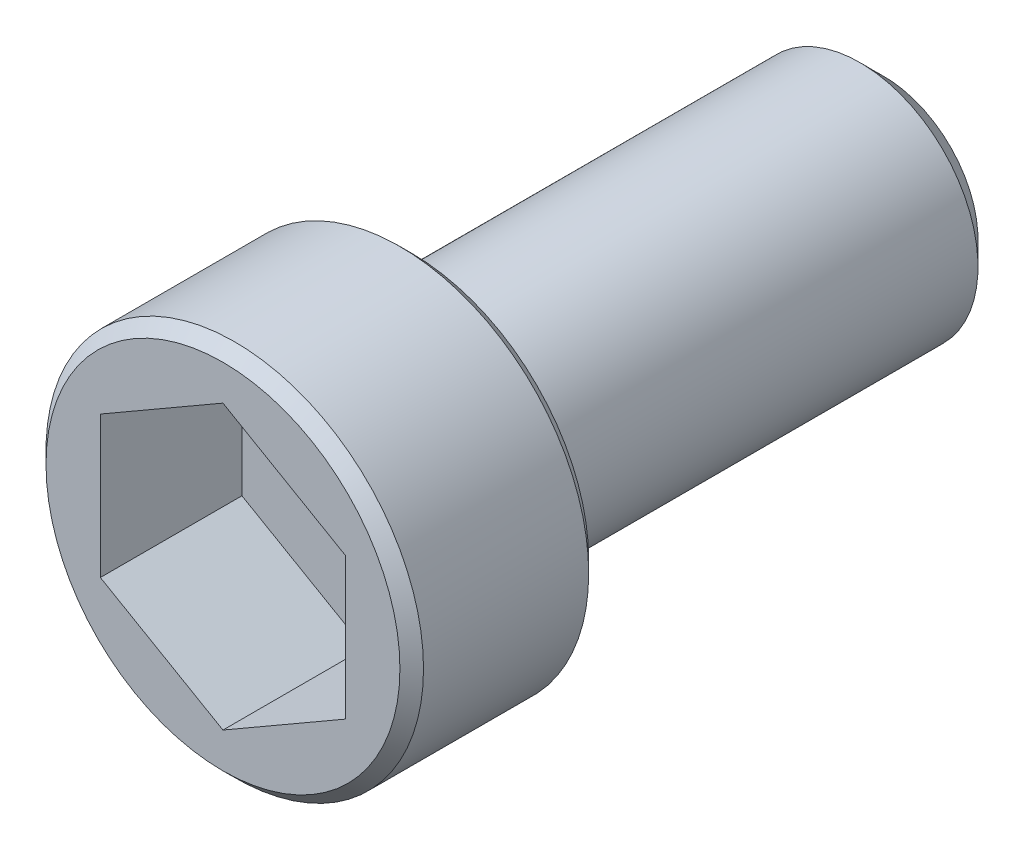
ISO-10303-21;
HEADER;
FILE_DESCRIPTION(('STEP AP214'),'2;1');
FILE_NAME('part.step','',(''),(''),'','','');
FILE_SCHEMA(('AUTOMOTIVE_DESIGN { 1 0 10303 214 1 1 1 1 }'));
ENDSEC;
DATA;
#1=APPLICATION_CONTEXT('core data for automotive mechanical design processes');
#2=APPLICATION_PROTOCOL_DEFINITION('international standard','automotive_design',2000,#1);
#3=PRODUCT_CONTEXT('',#1,'mechanical');
#4=PRODUCT('Part','Part','',(#3));
#5=PRODUCT_RELATED_PRODUCT_CATEGORY('part','',(#4));
#6=PRODUCT_DEFINITION_FORMATION('','',#4);
#7=PRODUCT_DEFINITION_CONTEXT('part definition',#1,'design');
#8=PRODUCT_DEFINITION('design','',#6,#7);
#9=PRODUCT_DEFINITION_SHAPE('','',#8);
#10=(LENGTH_UNIT() NAMED_UNIT(*) SI_UNIT(.MILLI.,.METRE.));
#11=(NAMED_UNIT(*) PLANE_ANGLE_UNIT() SI_UNIT($,.RADIAN.));
#12=(NAMED_UNIT(*) SI_UNIT($,.STERADIAN.) SOLID_ANGLE_UNIT());
#13=UNCERTAINTY_MEASURE_WITH_UNIT(LENGTH_MEASURE(1.E-05),#10,'distance_accuracy_value','');
#14=(GEOMETRIC_REPRESENTATION_CONTEXT(3) GLOBAL_UNCERTAINTY_ASSIGNED_CONTEXT((#13)) GLOBAL_UNIT_ASSIGNED_CONTEXT((#10,
#11,#12)) REPRESENTATION_CONTEXT('',''));
#15=CARTESIAN_POINT('',(0.,0.,0.));
#16=DIRECTION('',(0.,0.,1.));
#17=DIRECTION('',(1.,0.,0.));
#18=AXIS2_PLACEMENT_3D('',#15,#16,#17);
#19=CARTESIAN_POINT('',(0.,0.,-4.));
#20=DIRECTION('',(0.,0.,1.));
#21=DIRECTION('',(1.,0.,0.));
#22=AXIS2_PLACEMENT_3D('',#19,#20,#21);
#23=CYLINDRICAL_SURFACE('',#22,4.);
#24=CARTESIAN_POINT('',(0.,0.,-3.75));
#25=DIRECTION('',(0.,0.,1.));
#26=DIRECTION('',(1.,0.,0.));
#27=AXIS2_PLACEMENT_3D('',#24,#25,#26);
#28=CIRCLE('',#27,4.);
#29=CARTESIAN_POINT('',(4.,0.,-3.75));
#30=VERTEX_POINT('',#29);
#31=EDGE_CURVE('E152',#30,#30,#28,.T.);
#32=ORIENTED_EDGE('',*,*,#31,.T.);
#33=EDGE_LOOP('',(#32));
#34=FACE_BOUND('',#33,.T.);
#35=CARTESIAN_POINT('',(0.,0.,-0.250000000000002));
#36=DIRECTION('',(0.,0.,1.));
#37=DIRECTION('',(1.,0.,0.));
#38=AXIS2_PLACEMENT_3D('',#35,#36,#37);
#39=CIRCLE('',#38,4.);
#40=CARTESIAN_POINT('',(4.,0.,-0.250000000000002));
#41=VERTEX_POINT('',#40);
#42=EDGE_CURVE('E144',#41,#41,#39,.F.);
#43=ORIENTED_EDGE('',*,*,#42,.T.);
#44=EDGE_LOOP('',(#43));
#45=FACE_BOUND('',#44,.T.);
#46=ADVANCED_FACE('F41',(#34,#45),#23,.T.);
#47=CARTESIAN_POINT('',(0.,0.,-4.));
#48=DIRECTION('',(0.,0.,1.));
#49=DIRECTION('',(1.,0.,0.));
#50=AXIS2_PLACEMENT_3D('',#47,#48,#49);
#51=PLANE('',#50);
#52=CARTESIAN_POINT('',(0.,0.,-4.));
#53=DIRECTION('',(0.,0.,-1.));
#54=DIRECTION('',(-1.,0.,0.));
#55=AXIS2_PLACEMENT_3D('',#52,#53,#54);
#56=CIRCLE('',#55,2.5);
#57=CARTESIAN_POINT('',(-2.5,0.,-4.));
#58=VERTEX_POINT('',#57);
#59=EDGE_CURVE('E160',#58,#58,#56,.T.);
#60=ORIENTED_EDGE('',*,*,#59,.F.);
#61=EDGE_LOOP('',(#60));
#62=FACE_BOUND('',#61,.T.);
#63=CARTESIAN_POINT('',(0.,0.,-4.));
#64=DIRECTION('',(0.,0.,1.));
#65=DIRECTION('',(1.,0.,0.));
#66=AXIS2_PLACEMENT_3D('',#63,#64,#65);
#67=CIRCLE('',#66,3.75);
#68=CARTESIAN_POINT('',(3.75,0.,-4.));
#69=VERTEX_POINT('',#68);
#70=EDGE_CURVE('E155',#69,#69,#67,.F.);
#71=ORIENTED_EDGE('',*,*,#70,.T.);
#72=EDGE_LOOP('',(#71));
#73=FACE_BOUND('',#72,.T.);
#74=ADVANCED_FACE('F192',(#62,#73),#51,.F.);
#75=CARTESIAN_POINT('',(0.,0.,0.));
#76=DIRECTION('',(0.,0.,1.));
#77=DIRECTION('',(1.,0.,0.));
#78=AXIS2_PLACEMENT_3D('',#75,#76,#77);
#79=PLANE('',#78);
#80=DIRECTION('',(-0.866025403784439,0.5,0.));
#81=VECTOR('',#80,1.);
#82=CARTESIAN_POINT('',(2.59807621135332,1.5,0.));
#83=LINE('',#82,#81);
#84=CARTESIAN_POINT('',(2.59807621135332,1.5,0.));
#85=VERTEX_POINT('',#84);
#86=CARTESIAN_POINT('',(0.,3.,0.));
#87=VERTEX_POINT('',#86);
#88=EDGE_CURVE('E57',#85,#87,#83,.T.);
#89=ORIENTED_EDGE('',*,*,#88,.F.);
#90=DIRECTION('',(0.,1.,0.));
#91=VECTOR('',#90,1.);
#92=CARTESIAN_POINT('',(2.59807621135332,-1.5,0.));
#93=LINE('',#92,#91);
#94=CARTESIAN_POINT('',(2.59807621135332,-1.5,0.));
#95=VERTEX_POINT('',#94);
#96=EDGE_CURVE('E140',#95,#85,#93,.T.);
#97=ORIENTED_EDGE('',*,*,#96,.F.);
#98=DIRECTION('',(0.866025403784439,0.5,0.));
#99=VECTOR('',#98,1.);
#100=CARTESIAN_POINT('',(0.,-3.,0.));
#101=LINE('',#100,#99);
#102=CARTESIAN_POINT('',(0.,-3.,0.));
#103=VERTEX_POINT('',#102);
#104=EDGE_CURVE('E138',#103,#95,#101,.T.);
#105=ORIENTED_EDGE('',*,*,#104,.F.);
#106=DIRECTION('',(0.866025403784439,-0.5,0.));
#107=VECTOR('',#106,1.);
#108=CARTESIAN_POINT('',(-2.59807621135332,-1.5,0.));
#109=LINE('',#108,#107);
#110=CARTESIAN_POINT('',(-2.59807621135332,-1.5,0.));
#111=VERTEX_POINT('',#110);
#112=EDGE_CURVE('E105',#111,#103,#109,.T.);
#113=ORIENTED_EDGE('',*,*,#112,.F.);
#114=DIRECTION('',(0.,-1.,0.));
#115=VECTOR('',#114,1.);
#116=CARTESIAN_POINT('',(-2.59807621135332,1.5,0.));
#117=LINE('',#116,#115);
#118=CARTESIAN_POINT('',(-2.59807621135332,1.5,0.));
#119=VERTEX_POINT('',#118);
#120=EDGE_CURVE('E134',#119,#111,#117,.T.);
#121=ORIENTED_EDGE('',*,*,#120,.F.);
#122=DIRECTION('',(-0.866025403784439,-0.5,0.));
#123=VECTOR('',#122,1.);
#124=CARTESIAN_POINT('',(0.,3.,0.));
#125=LINE('',#124,#123);
#126=EDGE_CURVE('E131',#87,#119,#125,.T.);
#127=ORIENTED_EDGE('',*,*,#126,.F.);
#128=EDGE_LOOP('',(#89,#97,#105,#113,#121,#127));
#129=FACE_BOUND('',#128,.T.);
#130=CARTESIAN_POINT('',(0.,0.,0.));
#131=DIRECTION('',(0.,0.,1.));
#132=DIRECTION('',(1.,0.,0.));
#133=AXIS2_PLACEMENT_3D('',#130,#131,#132);
#134=CIRCLE('',#133,3.75);
#135=CARTESIAN_POINT('',(3.75,0.,0.));
#136=VERTEX_POINT('',#135);
#137=EDGE_CURVE('E158',#136,#136,#134,.T.);
#138=ORIENTED_EDGE('',*,*,#137,.T.);
#139=EDGE_LOOP('',(#138));
#140=FACE_BOUND('',#139,.T.);
#141=ADVANCED_FACE('F176',(#129,#140),#79,.T.);
#142=CARTESIAN_POINT('',(0.,0.,-3.75));
#143=DIRECTION('',(0.,0.,1.));
#144=DIRECTION('',(1.,0.,0.));
#145=AXIS2_PLACEMENT_3D('',#142,#143,#144);
#146=CONICAL_SURFACE('',#145,4.,0.785398163397448);
#147=ORIENTED_EDGE('',*,*,#70,.F.);
#148=EDGE_LOOP('',(#147));
#149=FACE_BOUND('',#148,.T.);
#150=ORIENTED_EDGE('',*,*,#31,.F.);
#151=EDGE_LOOP('',(#150));
#152=FACE_BOUND('',#151,.T.);
#153=ADVANCED_FACE('F205',(#149,#152),#146,.T.);
#154=CARTESIAN_POINT('',(0.,0.,0.));
#155=DIRECTION('',(0.,0.,-1.));
#156=DIRECTION('',(-1.,0.,0.));
#157=AXIS2_PLACEMENT_3D('',#154,#155,#156);
#158=CONICAL_SURFACE('',#157,3.75,0.785398163397441);
#159=ORIENTED_EDGE('',*,*,#42,.F.);
#160=EDGE_LOOP('',(#159));
#161=FACE_BOUND('',#160,.T.);
#162=ORIENTED_EDGE('',*,*,#137,.F.);
#163=EDGE_LOOP('',(#162));
#164=FACE_BOUND('',#163,.T.);
#165=ADVANCED_FACE('F188',(#161,#164),#158,.T.);
#166=CARTESIAN_POINT('',(2.59807621135332,1.5,-3.));
#167=DIRECTION('',(0.5,0.866025403784439,0.));
#168=DIRECTION('',(-0.866025403784439,0.5,0.));
#169=AXIS2_PLACEMENT_3D('',#166,#167,#168);
#170=PLANE('',#169);
#171=ORIENTED_EDGE('',*,*,#88,.T.);
#172=DIRECTION('',(0.,0.,1.));
#173=VECTOR('',#172,1.);
#174=CARTESIAN_POINT('',(0.,3.,-3.));
#175=LINE('',#174,#173);
#176=CARTESIAN_POINT('',(0.,3.,-3.));
#177=VERTEX_POINT('',#176);
#178=EDGE_CURVE('E87',#177,#87,#175,.T.);
#179=ORIENTED_EDGE('',*,*,#178,.F.);
#180=DIRECTION('',(-0.866025403784439,0.5,0.));
#181=VECTOR('',#180,1.);
#182=CARTESIAN_POINT('',(2.59807621135332,1.5,-3.));
#183=LINE('',#182,#181);
#184=CARTESIAN_POINT('',(2.59807621135332,1.5,-3.));
#185=VERTEX_POINT('',#184);
#186=EDGE_CURVE('E142',#185,#177,#183,.T.);
#187=ORIENTED_EDGE('',*,*,#186,.F.);
#188=DIRECTION('',(0.,0.,1.));
#189=VECTOR('',#188,1.);
#190=CARTESIAN_POINT('',(2.59807621135332,1.5,-3.));
#191=LINE('',#190,#189);
#192=EDGE_CURVE('E65',#185,#85,#191,.T.);
#193=ORIENTED_EDGE('',*,*,#192,.T.);
#194=EDGE_LOOP('',(#171,#179,#187,#193));
#195=FACE_BOUND('',#194,.T.);
#196=ADVANCED_FACE('F181',(#195),#170,.F.);
#197=CARTESIAN_POINT('',(2.59807621135332,-1.5,-3.));
#198=DIRECTION('',(1.,0.,0.));
#199=DIRECTION('',(0.,0.,-1.));
#200=AXIS2_PLACEMENT_3D('',#197,#198,#199);
#201=PLANE('',#200);
#202=ORIENTED_EDGE('',*,*,#96,.T.);
#203=ORIENTED_EDGE('',*,*,#192,.F.);
#204=DIRECTION('',(0.,1.,0.));
#205=VECTOR('',#204,1.);
#206=CARTESIAN_POINT('',(2.59807621135332,-1.5,-3.));
#207=LINE('',#206,#205);
#208=CARTESIAN_POINT('',(2.59807621135332,-1.5,-3.));
#209=VERTEX_POINT('',#208);
#210=EDGE_CURVE('E117',#209,#185,#207,.T.);
#211=ORIENTED_EDGE('',*,*,#210,.F.);
#212=DIRECTION('',(0.,0.,1.));
#213=VECTOR('',#212,1.);
#214=CARTESIAN_POINT('',(2.59807621135332,-1.5,-3.));
#215=LINE('',#214,#213);
#216=EDGE_CURVE('E109',#209,#95,#215,.T.);
#217=ORIENTED_EDGE('',*,*,#216,.T.);
#218=EDGE_LOOP('',(#202,#203,#211,#217));
#219=FACE_BOUND('',#218,.T.);
#220=ADVANCED_FACE('F179',(#219),#201,.F.);
#221=CARTESIAN_POINT('',(0.,-3.,-3.));
#222=DIRECTION('',(0.5,-0.866025403784439,0.));
#223=DIRECTION('',(0.866025403784439,0.5,0.));
#224=AXIS2_PLACEMENT_3D('',#221,#222,#223);
#225=PLANE('',#224);
#226=ORIENTED_EDGE('',*,*,#104,.T.);
#227=ORIENTED_EDGE('',*,*,#216,.F.);
#228=DIRECTION('',(0.866025403784439,0.5,0.));
#229=VECTOR('',#228,1.);
#230=CARTESIAN_POINT('',(0.,-3.,-3.));
#231=LINE('',#230,#229);
#232=CARTESIAN_POINT('',(0.,-3.,-3.));
#233=VERTEX_POINT('',#232);
#234=EDGE_CURVE('E113',#233,#209,#231,.T.);
#235=ORIENTED_EDGE('',*,*,#234,.F.);
#236=DIRECTION('',(0.,0.,1.));
#237=VECTOR('',#236,1.);
#238=CARTESIAN_POINT('',(0.,-3.,-3.));
#239=LINE('',#238,#237);
#240=EDGE_CURVE('E98',#233,#103,#239,.T.);
#241=ORIENTED_EDGE('',*,*,#240,.T.);
#242=EDGE_LOOP('',(#226,#227,#235,#241));
#243=FACE_BOUND('',#242,.T.);
#244=ADVANCED_FACE('F114',(#243),#225,.F.);
#245=CARTESIAN_POINT('',(-2.59807621135332,-1.5,-3.));
#246=DIRECTION('',(-0.5,-0.866025403784439,0.));
#247=DIRECTION('',(0.866025403784439,-0.5,0.));
#248=AXIS2_PLACEMENT_3D('',#245,#246,#247);
#249=PLANE('',#248);
#250=ORIENTED_EDGE('',*,*,#112,.T.);
#251=ORIENTED_EDGE('',*,*,#240,.F.);
#252=DIRECTION('',(0.866025403784439,-0.5,0.));
#253=VECTOR('',#252,1.);
#254=CARTESIAN_POINT('',(-2.59807621135332,-1.5,-3.));
#255=LINE('',#254,#253);
#256=CARTESIAN_POINT('',(-2.59807621135332,-1.5,-3.));
#257=VERTEX_POINT('',#256);
#258=EDGE_CURVE('E102',#257,#233,#255,.T.);
#259=ORIENTED_EDGE('',*,*,#258,.F.);
#260=DIRECTION('',(0.,0.,1.));
#261=VECTOR('',#260,1.);
#262=CARTESIAN_POINT('',(-2.59807621135332,-1.5,-3.));
#263=LINE('',#262,#261);
#264=EDGE_CURVE('E110',#257,#111,#263,.T.);
#265=ORIENTED_EDGE('',*,*,#264,.T.);
#266=EDGE_LOOP('',(#250,#251,#259,#265));
#267=FACE_BOUND('',#266,.T.);
#268=ADVANCED_FACE('F100',(#267),#249,.F.);
#269=CARTESIAN_POINT('',(-2.59807621135332,1.5,-3.));
#270=DIRECTION('',(-1.,0.,0.));
#271=DIRECTION('',(0.,0.,1.));
#272=AXIS2_PLACEMENT_3D('',#269,#270,#271);
#273=PLANE('',#272);
#274=ORIENTED_EDGE('',*,*,#120,.T.);
#275=ORIENTED_EDGE('',*,*,#264,.F.);
#276=DIRECTION('',(0.,-1.,0.));
#277=VECTOR('',#276,1.);
#278=CARTESIAN_POINT('',(-2.59807621135332,1.5,-3.));
#279=LINE('',#278,#277);
#280=CARTESIAN_POINT('',(-2.59807621135332,1.5,-3.));
#281=VERTEX_POINT('',#280);
#282=EDGE_CURVE('E123',#281,#257,#279,.T.);
#283=ORIENTED_EDGE('',*,*,#282,.F.);
#284=DIRECTION('',(0.,0.,1.));
#285=VECTOR('',#284,1.);
#286=CARTESIAN_POINT('',(-2.59807621135332,1.5,-3.));
#287=LINE('',#286,#285);
#288=EDGE_CURVE('E147',#281,#119,#287,.T.);
#289=ORIENTED_EDGE('',*,*,#288,.T.);
#290=EDGE_LOOP('',(#274,#275,#283,#289));
#291=FACE_BOUND('',#290,.T.);
#292=ADVANCED_FACE('F174',(#291),#273,.F.);
#293=CARTESIAN_POINT('',(0.,3.,-3.));
#294=DIRECTION('',(-0.5,0.866025403784439,0.));
#295=DIRECTION('',(-0.866025403784439,-0.5,0.));
#296=AXIS2_PLACEMENT_3D('',#293,#294,#295);
#297=PLANE('',#296);
#298=ORIENTED_EDGE('',*,*,#126,.T.);
#299=ORIENTED_EDGE('',*,*,#288,.F.);
#300=DIRECTION('',(-0.866025403784439,-0.5,0.));
#301=VECTOR('',#300,1.);
#302=CARTESIAN_POINT('',(0.,3.,-3.));
#303=LINE('',#302,#301);
#304=EDGE_CURVE('E125',#177,#281,#303,.T.);
#305=ORIENTED_EDGE('',*,*,#304,.F.);
#306=ORIENTED_EDGE('',*,*,#178,.T.);
#307=EDGE_LOOP('',(#298,#299,#305,#306));
#308=FACE_BOUND('',#307,.T.);
#309=ADVANCED_FACE('F170',(#308),#297,.F.);
#310=CARTESIAN_POINT('',(0.,0.,-3.));
#311=DIRECTION('',(0.,0.,1.));
#312=DIRECTION('',(1.,0.,0.));
#313=AXIS2_PLACEMENT_3D('',#310,#311,#312);
#314=PLANE('',#313);
#315=ORIENTED_EDGE('',*,*,#186,.T.);
#316=ORIENTED_EDGE('',*,*,#304,.T.);
#317=ORIENTED_EDGE('',*,*,#282,.T.);
#318=ORIENTED_EDGE('',*,*,#258,.T.);
#319=ORIENTED_EDGE('',*,*,#234,.T.);
#320=ORIENTED_EDGE('',*,*,#210,.T.);
#321=EDGE_LOOP('',(#315,#316,#317,#318,#319,#320));
#322=FACE_BOUND('',#321,.T.);
#323=ADVANCED_FACE('F120',(#322),#314,.T.);
#324=CARTESIAN_POINT('',(0.,0.,-14.));
#325=DIRECTION('',(0.,0.,1.));
#326=DIRECTION('',(1.,0.,0.));
#327=AXIS2_PLACEMENT_3D('',#324,#325,#326);
#328=CYLINDRICAL_SURFACE('',#327,2.5);
#329=CARTESIAN_POINT('',(0.,0.,-13.5));
#330=DIRECTION('',(0.,0.,-1.));
#331=DIRECTION('',(-1.,0.,0.));
#332=AXIS2_PLACEMENT_3D('',#329,#330,#331);
#333=CIRCLE('',#332,2.5);
#334=CARTESIAN_POINT('',(-2.5,0.,-13.5));
#335=VERTEX_POINT('',#334);
#336=EDGE_CURVE('E11',#335,#335,#333,.F.);
#337=ORIENTED_EDGE('',*,*,#336,.T.);
#338=EDGE_LOOP('',(#337));
#339=FACE_BOUND('',#338,.T.);
#340=ORIENTED_EDGE('',*,*,#59,.T.);
#341=EDGE_LOOP('',(#340));
#342=FACE_BOUND('',#341,.T.);
#343=ADVANCED_FACE('F276',(#339,#342),#328,.T.);
#344=CARTESIAN_POINT('',(0.,0.,-14.));
#345=DIRECTION('',(0.,0.,-1.));
#346=DIRECTION('',(-1.,0.,0.));
#347=AXIS2_PLACEMENT_3D('',#344,#345,#346);
#348=PLANE('',#347);
#349=CARTESIAN_POINT('',(0.,0.,-14.));
#350=DIRECTION('',(0.,0.,-1.));
#351=DIRECTION('',(-1.,0.,0.));
#352=AXIS2_PLACEMENT_3D('',#349,#350,#351);
#353=CIRCLE('',#352,2.);
#354=CARTESIAN_POINT('',(-2.,0.,-14.));
#355=VERTEX_POINT('',#354);
#356=EDGE_CURVE('E50',#355,#355,#353,.T.);
#357=ORIENTED_EDGE('',*,*,#356,.T.);
#358=EDGE_LOOP('',(#357));
#359=FACE_BOUND('',#358,.T.);
#360=ADVANCED_FACE('F284',(#359),#348,.T.);
#361=CARTESIAN_POINT('',(0.,0.,-14.));
#362=DIRECTION('',(0.,0.,1.));
#363=DIRECTION('',(1.,0.,0.));
#364=AXIS2_PLACEMENT_3D('',#361,#362,#363);
#365=CONICAL_SURFACE('',#364,2.,0.785398163397444);
#366=ORIENTED_EDGE('',*,*,#336,.F.);
#367=EDGE_LOOP('',(#366));
#368=FACE_BOUND('',#367,.T.);
#369=ORIENTED_EDGE('',*,*,#356,.F.);
#370=EDGE_LOOP('',(#369));
#371=FACE_BOUND('',#370,.T.);
#372=ADVANCED_FACE('F44',(#368,#371),#365,.T.);
#373=CLOSED_SHELL('',(#46,#74,#141,#153,#165,#196,#220,#244,#268,#292,#309,#323,#343,#360,#372));
#374=MANIFOLD_SOLID_BREP('B2',#373);
#375=ADVANCED_BREP_SHAPE_REPRESENTATION('',(#18,#374),#14);
#376=SHAPE_DEFINITION_REPRESENTATION(#9,#375);
ENDSEC;
END-ISO-10303-21;
